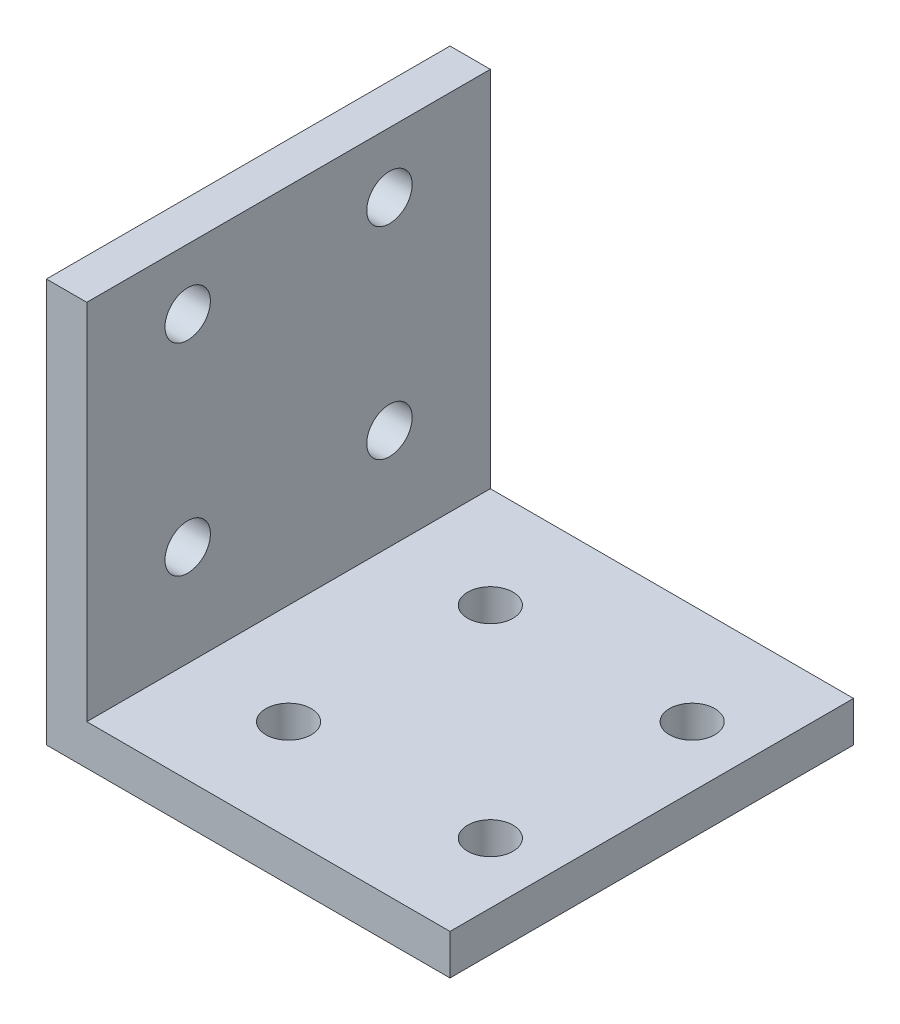
ISO-10303-21;
HEADER;
FILE_DESCRIPTION(('STEP AP214'),'2;1');
FILE_NAME('part.step','',(''),(''),'','','');
FILE_SCHEMA(('AUTOMOTIVE_DESIGN { 1 0 10303 214 1 1 1 1 }'));
ENDSEC;
DATA;
#1=APPLICATION_CONTEXT('core data for automotive mechanical design processes');
#2=APPLICATION_PROTOCOL_DEFINITION('international standard','automotive_design',2000,#1);
#3=PRODUCT_CONTEXT('',#1,'mechanical');
#4=PRODUCT('Part','Part','',(#3));
#5=PRODUCT_RELATED_PRODUCT_CATEGORY('part','',(#4));
#6=PRODUCT_DEFINITION_FORMATION('','',#4);
#7=PRODUCT_DEFINITION_CONTEXT('part definition',#1,'design');
#8=PRODUCT_DEFINITION('design','',#6,#7);
#9=PRODUCT_DEFINITION_SHAPE('','',#8);
#10=(LENGTH_UNIT() NAMED_UNIT(*) SI_UNIT(.MILLI.,.METRE.));
#11=(NAMED_UNIT(*) PLANE_ANGLE_UNIT() SI_UNIT($,.RADIAN.));
#12=(NAMED_UNIT(*) SI_UNIT($,.STERADIAN.) SOLID_ANGLE_UNIT());
#13=UNCERTAINTY_MEASURE_WITH_UNIT(LENGTH_MEASURE(1.E-05),#10,'distance_accuracy_value','');
#14=(GEOMETRIC_REPRESENTATION_CONTEXT(3) GLOBAL_UNCERTAINTY_ASSIGNED_CONTEXT((#13)) GLOBAL_UNIT_ASSIGNED_CONTEXT((#10,
#11,#12)) REPRESENTATION_CONTEXT('',''));
#15=CARTESIAN_POINT('',(0.,0.,0.));
#16=DIRECTION('',(0.,0.,1.));
#17=DIRECTION('',(1.,0.,0.));
#18=AXIS2_PLACEMENT_3D('',#15,#16,#17);
#19=CARTESIAN_POINT('',(40.,0.,40.));
#20=DIRECTION('',(0.,1.,0.));
#21=DIRECTION('',(-1.,0.,0.));
#22=AXIS2_PLACEMENT_3D('',#19,#20,#21);
#23=PLANE('',#22);
#24=CARTESIAN_POINT('',(34.,0.,10.));
#25=DIRECTION('',(0.,1.,0.));
#26=DIRECTION('',(-1.,0.,0.));
#27=AXIS2_PLACEMENT_3D('',#24,#25,#26);
#28=CIRCLE('',#27,2.25);
#29=CARTESIAN_POINT('',(31.75,0.,10.));
#30=VERTEX_POINT('',#29);
#31=EDGE_CURVE('E164',#30,#30,#28,.T.);
#32=ORIENTED_EDGE('',*,*,#31,.T.);
#33=EDGE_LOOP('',(#32));
#34=FACE_BOUND('',#33,.T.);
#35=CARTESIAN_POINT('',(14.,0.,10.));
#36=DIRECTION('',(0.,1.,0.));
#37=DIRECTION('',(-1.,0.,0.));
#38=AXIS2_PLACEMENT_3D('',#35,#36,#37);
#39=CIRCLE('',#38,2.25);
#40=CARTESIAN_POINT('',(11.75,0.,10.));
#41=VERTEX_POINT('',#40);
#42=EDGE_CURVE('E170',#41,#41,#39,.T.);
#43=ORIENTED_EDGE('',*,*,#42,.T.);
#44=EDGE_LOOP('',(#43));
#45=FACE_BOUND('',#44,.T.);
#46=CARTESIAN_POINT('',(34.0000000000001,0.,30.));
#47=DIRECTION('',(0.,1.,0.));
#48=DIRECTION('',(-1.,0.,0.));
#49=AXIS2_PLACEMENT_3D('',#46,#47,#48);
#50=CIRCLE('',#49,2.25);
#51=CARTESIAN_POINT('',(31.7500000000001,0.,30.));
#52=VERTEX_POINT('',#51);
#53=EDGE_CURVE('E176',#52,#52,#50,.T.);
#54=ORIENTED_EDGE('',*,*,#53,.T.);
#55=EDGE_LOOP('',(#54));
#56=FACE_BOUND('',#55,.T.);
#57=CARTESIAN_POINT('',(14.0000000000001,0.,30.));
#58=DIRECTION('',(0.,1.,0.));
#59=DIRECTION('',(-1.,0.,0.));
#60=AXIS2_PLACEMENT_3D('',#57,#58,#59);
#61=CIRCLE('',#60,2.25);
#62=CARTESIAN_POINT('',(11.7500000000001,0.,30.));
#63=VERTEX_POINT('',#62);
#64=EDGE_CURVE('E124',#63,#63,#61,.T.);
#65=ORIENTED_EDGE('',*,*,#64,.T.);
#66=EDGE_LOOP('',(#65));
#67=FACE_BOUND('',#66,.T.);
#68=DIRECTION('',(1.,0.,0.));
#69=VECTOR('',#68,1.);
#70=CARTESIAN_POINT('',(40.,0.,0.));
#71=LINE('',#70,#69);
#72=CARTESIAN_POINT('',(0.,0.,0.));
#73=VERTEX_POINT('',#72);
#74=CARTESIAN_POINT('',(40.,0.,0.));
#75=VERTEX_POINT('',#74);
#76=EDGE_CURVE('E120',#73,#75,#71,.T.);
#77=ORIENTED_EDGE('',*,*,#76,.T.);
#78=DIRECTION('',(0.,0.,-1.));
#79=VECTOR('',#78,1.);
#80=CARTESIAN_POINT('',(40.,0.,40.));
#81=LINE('',#80,#79);
#82=CARTESIAN_POINT('',(40.,0.,40.));
#83=VERTEX_POINT('',#82);
#84=EDGE_CURVE('E11',#83,#75,#81,.T.);
#85=ORIENTED_EDGE('',*,*,#84,.F.);
#86=DIRECTION('',(1.,0.,0.));
#87=VECTOR('',#86,1.);
#88=CARTESIAN_POINT('',(40.,0.,40.));
#89=LINE('',#88,#87);
#90=CARTESIAN_POINT('',(0.,0.,40.));
#91=VERTEX_POINT('',#90);
#92=EDGE_CURVE('E131',#91,#83,#89,.T.);
#93=ORIENTED_EDGE('',*,*,#92,.F.);
#94=DIRECTION('',(0.,0.,-1.));
#95=VECTOR('',#94,1.);
#96=CARTESIAN_POINT('',(0.,0.,40.));
#97=LINE('',#96,#95);
#98=EDGE_CURVE('E116',#91,#73,#97,.T.);
#99=ORIENTED_EDGE('',*,*,#98,.T.);
#100=EDGE_LOOP('',(#77,#85,#93,#99));
#101=FACE_BOUND('',#100,.T.);
#102=ADVANCED_FACE('F34',(#34,#45,#56,#67,#101),#23,.F.);
#103=CARTESIAN_POINT('',(40.,4.,40.));
#104=DIRECTION('',(-1.,0.,0.));
#105=DIRECTION('',(0.,0.,1.));
#106=AXIS2_PLACEMENT_3D('',#103,#104,#105);
#107=PLANE('',#106);
#108=DIRECTION('',(0.,1.,0.));
#109=VECTOR('',#108,1.);
#110=CARTESIAN_POINT('',(40.,4.,0.));
#111=LINE('',#110,#109);
#112=CARTESIAN_POINT('',(40.,4.,0.));
#113=VERTEX_POINT('',#112);
#114=EDGE_CURVE('E123',#75,#113,#111,.T.);
#115=ORIENTED_EDGE('',*,*,#114,.T.);
#116=DIRECTION('',(0.,0.,-1.));
#117=VECTOR('',#116,1.);
#118=CARTESIAN_POINT('',(40.,4.,40.));
#119=LINE('',#118,#117);
#120=CARTESIAN_POINT('',(40.,4.,40.));
#121=VERTEX_POINT('',#120);
#122=EDGE_CURVE('E43',#121,#113,#119,.T.);
#123=ORIENTED_EDGE('',*,*,#122,.F.);
#124=DIRECTION('',(0.,1.,0.));
#125=VECTOR('',#124,1.);
#126=CARTESIAN_POINT('',(40.,4.,40.));
#127=LINE('',#126,#125);
#128=EDGE_CURVE('E89',#83,#121,#127,.T.);
#129=ORIENTED_EDGE('',*,*,#128,.F.);
#130=ORIENTED_EDGE('',*,*,#84,.T.);
#131=EDGE_LOOP('',(#115,#123,#129,#130));
#132=FACE_BOUND('',#131,.T.);
#133=ADVANCED_FACE('F187',(#132),#107,.F.);
#134=CARTESIAN_POINT('',(4.00000000000001,4.,40.));
#135=DIRECTION('',(0.,-1.,0.));
#136=DIRECTION('',(1.,0.,0.));
#137=AXIS2_PLACEMENT_3D('',#134,#135,#136);
#138=PLANE('',#137);
#139=CARTESIAN_POINT('',(34.,4.,10.));
#140=DIRECTION('',(0.,1.,0.));
#141=DIRECTION('',(0.,0.,1.));
#142=AXIS2_PLACEMENT_3D('',#139,#140,#141);
#143=CIRCLE('',#142,2.25);
#144=CARTESIAN_POINT('',(34.,4.,12.25));
#145=VERTEX_POINT('',#144);
#146=EDGE_CURVE('E140',#145,#145,#143,.T.);
#147=ORIENTED_EDGE('',*,*,#146,.F.);
#148=EDGE_LOOP('',(#147));
#149=FACE_BOUND('',#148,.T.);
#150=CARTESIAN_POINT('',(14.,4.,10.));
#151=DIRECTION('',(0.,1.,0.));
#152=DIRECTION('',(0.,0.,1.));
#153=AXIS2_PLACEMENT_3D('',#150,#151,#152);
#154=CIRCLE('',#153,2.25);
#155=CARTESIAN_POINT('',(14.,4.,12.25));
#156=VERTEX_POINT('',#155);
#157=EDGE_CURVE('E167',#156,#156,#154,.T.);
#158=ORIENTED_EDGE('',*,*,#157,.F.);
#159=EDGE_LOOP('',(#158));
#160=FACE_BOUND('',#159,.T.);
#161=CARTESIAN_POINT('',(34.0000000000001,4.,30.));
#162=DIRECTION('',(0.,1.,0.));
#163=DIRECTION('',(0.,0.,1.));
#164=AXIS2_PLACEMENT_3D('',#161,#162,#163);
#165=CIRCLE('',#164,2.25);
#166=CARTESIAN_POINT('',(34.0000000000001,4.,32.25));
#167=VERTEX_POINT('',#166);
#168=EDGE_CURVE('E173',#167,#167,#165,.T.);
#169=ORIENTED_EDGE('',*,*,#168,.F.);
#170=EDGE_LOOP('',(#169));
#171=FACE_BOUND('',#170,.T.);
#172=CARTESIAN_POINT('',(14.0000000000001,4.,30.));
#173=DIRECTION('',(0.,1.,0.));
#174=DIRECTION('',(0.,0.,1.));
#175=AXIS2_PLACEMENT_3D('',#172,#173,#174);
#176=CIRCLE('',#175,2.25);
#177=CARTESIAN_POINT('',(14.0000000000001,4.,32.25));
#178=VERTEX_POINT('',#177);
#179=EDGE_CURVE('E179',#178,#178,#176,.T.);
#180=ORIENTED_EDGE('',*,*,#179,.F.);
#181=EDGE_LOOP('',(#180));
#182=FACE_BOUND('',#181,.T.);
#183=DIRECTION('',(-1.,0.,0.));
#184=VECTOR('',#183,1.);
#185=CARTESIAN_POINT('',(4.00000000000001,4.,0.));
#186=LINE('',#185,#184);
#187=CARTESIAN_POINT('',(4.00000000000001,4.,0.));
#188=VERTEX_POINT('',#187);
#189=EDGE_CURVE('E126',#113,#188,#186,.T.);
#190=ORIENTED_EDGE('',*,*,#189,.T.);
#191=DIRECTION('',(0.,0.,-1.));
#192=VECTOR('',#191,1.);
#193=CARTESIAN_POINT('',(4.00000000000001,4.,40.));
#194=LINE('',#193,#192);
#195=CARTESIAN_POINT('',(4.00000000000001,4.,40.));
#196=VERTEX_POINT('',#195);
#197=EDGE_CURVE('E111',#196,#188,#194,.T.);
#198=ORIENTED_EDGE('',*,*,#197,.F.);
#199=DIRECTION('',(-1.,0.,0.));
#200=VECTOR('',#199,1.);
#201=CARTESIAN_POINT('',(4.00000000000001,4.,40.));
#202=LINE('',#201,#200);
#203=EDGE_CURVE('E102',#121,#196,#202,.T.);
#204=ORIENTED_EDGE('',*,*,#203,.F.);
#205=ORIENTED_EDGE('',*,*,#122,.T.);
#206=EDGE_LOOP('',(#190,#198,#204,#205));
#207=FACE_BOUND('',#206,.T.);
#208=ADVANCED_FACE('F190',(#149,#160,#171,#182,#207),#138,.F.);
#209=CARTESIAN_POINT('',(4.,40.,40.));
#210=DIRECTION('',(-1.,0.,0.));
#211=DIRECTION('',(0.,-1.,0.));
#212=AXIS2_PLACEMENT_3D('',#209,#210,#211);
#213=PLANE('',#212);
#214=CARTESIAN_POINT('',(4.,34.,10.));
#215=DIRECTION('',(1.,0.,0.));
#216=DIRECTION('',(0.,0.,-1.));
#217=AXIS2_PLACEMENT_3D('',#214,#215,#216);
#218=CIRCLE('',#217,2.24999999999999);
#219=CARTESIAN_POINT('',(4.,34.,7.75000000000001));
#220=VERTEX_POINT('',#219);
#221=EDGE_CURVE('E157',#220,#220,#218,.T.);
#222=ORIENTED_EDGE('',*,*,#221,.F.);
#223=EDGE_LOOP('',(#222));
#224=FACE_BOUND('',#223,.T.);
#225=CARTESIAN_POINT('',(4.,33.9999999999999,30.));
#226=DIRECTION('',(1.,0.,0.));
#227=DIRECTION('',(0.,0.,-1.));
#228=AXIS2_PLACEMENT_3D('',#225,#226,#227);
#229=CIRCLE('',#228,2.24999999999999);
#230=CARTESIAN_POINT('',(4.,33.9999999999999,27.75));
#231=VERTEX_POINT('',#230);
#232=EDGE_CURVE('E147',#231,#231,#229,.T.);
#233=ORIENTED_EDGE('',*,*,#232,.F.);
#234=EDGE_LOOP('',(#233));
#235=FACE_BOUND('',#234,.T.);
#236=CARTESIAN_POINT('',(4.00000000000001,14.,9.99999999999979));
#237=DIRECTION('',(1.,0.,0.));
#238=DIRECTION('',(0.,0.,-1.));
#239=AXIS2_PLACEMENT_3D('',#236,#237,#238);
#240=CIRCLE('',#239,2.24999999999999);
#241=CARTESIAN_POINT('',(4.00000000000001,14.,7.7499999999998));
#242=VERTEX_POINT('',#241);
#243=EDGE_CURVE('E144',#242,#242,#240,.T.);
#244=ORIENTED_EDGE('',*,*,#243,.F.);
#245=EDGE_LOOP('',(#244));
#246=FACE_BOUND('',#245,.T.);
#247=CARTESIAN_POINT('',(4.00000000000001,13.9999999999999,29.9999999999998));
#248=DIRECTION('',(1.,0.,0.));
#249=DIRECTION('',(0.,0.,-1.));
#250=AXIS2_PLACEMENT_3D('',#247,#248,#249);
#251=CIRCLE('',#250,2.24999999999999);
#252=CARTESIAN_POINT('',(4.00000000000001,13.9999999999999,27.7499999999998));
#253=VERTEX_POINT('',#252);
#254=EDGE_CURVE('E141',#253,#253,#251,.T.);
#255=ORIENTED_EDGE('',*,*,#254,.F.);
#256=EDGE_LOOP('',(#255));
#257=FACE_BOUND('',#256,.T.);
#258=DIRECTION('',(0.,1.,0.));
#259=VECTOR('',#258,1.);
#260=CARTESIAN_POINT('',(4.,40.,0.));
#261=LINE('',#260,#259);
#262=CARTESIAN_POINT('',(4.,40.,0.));
#263=VERTEX_POINT('',#262);
#264=EDGE_CURVE('E110',#188,#263,#261,.T.);
#265=ORIENTED_EDGE('',*,*,#264,.T.);
#266=DIRECTION('',(0.,0.,-1.));
#267=VECTOR('',#266,1.);
#268=CARTESIAN_POINT('',(4.,40.,40.));
#269=LINE('',#268,#267);
#270=CARTESIAN_POINT('',(4.,40.,40.));
#271=VERTEX_POINT('',#270);
#272=EDGE_CURVE('E107',#271,#263,#269,.T.);
#273=ORIENTED_EDGE('',*,*,#272,.F.);
#274=DIRECTION('',(0.,1.,0.));
#275=VECTOR('',#274,1.);
#276=CARTESIAN_POINT('',(4.,40.,40.));
#277=LINE('',#276,#275);
#278=EDGE_CURVE('E96',#196,#271,#277,.T.);
#279=ORIENTED_EDGE('',*,*,#278,.F.);
#280=ORIENTED_EDGE('',*,*,#197,.T.);
#281=EDGE_LOOP('',(#265,#273,#279,#280));
#282=FACE_BOUND('',#281,.T.);
#283=ADVANCED_FACE('F108',(#224,#235,#246,#257,#282),#213,.F.);
#284=CARTESIAN_POINT('',(0.,40.,40.));
#285=DIRECTION('',(0.,-1.,0.));
#286=DIRECTION('',(0.,0.,-1.));
#287=AXIS2_PLACEMENT_3D('',#284,#285,#286);
#288=PLANE('',#287);
#289=DIRECTION('',(-1.,0.,0.));
#290=VECTOR('',#289,1.);
#291=CARTESIAN_POINT('',(0.,40.,0.));
#292=LINE('',#291,#290);
#293=CARTESIAN_POINT('',(0.,40.,0.));
#294=VERTEX_POINT('',#293);
#295=EDGE_CURVE('E75',#263,#294,#292,.T.);
#296=ORIENTED_EDGE('',*,*,#295,.T.);
#297=DIRECTION('',(0.,0.,-1.));
#298=VECTOR('',#297,1.);
#299=CARTESIAN_POINT('',(0.,40.,40.));
#300=LINE('',#299,#298);
#301=CARTESIAN_POINT('',(0.,40.,40.));
#302=VERTEX_POINT('',#301);
#303=EDGE_CURVE('E112',#302,#294,#300,.T.);
#304=ORIENTED_EDGE('',*,*,#303,.F.);
#305=DIRECTION('',(-1.,0.,0.));
#306=VECTOR('',#305,1.);
#307=CARTESIAN_POINT('',(0.,40.,40.));
#308=LINE('',#307,#306);
#309=EDGE_CURVE('E100',#271,#302,#308,.T.);
#310=ORIENTED_EDGE('',*,*,#309,.F.);
#311=ORIENTED_EDGE('',*,*,#272,.T.);
#312=EDGE_LOOP('',(#296,#304,#310,#311));
#313=FACE_BOUND('',#312,.T.);
#314=ADVANCED_FACE('F114',(#313),#288,.F.);
#315=CARTESIAN_POINT('',(0.,0.,40.));
#316=DIRECTION('',(1.,0.,0.));
#317=DIRECTION('',(0.,0.,-1.));
#318=AXIS2_PLACEMENT_3D('',#315,#316,#317);
#319=PLANE('',#318);
#320=CARTESIAN_POINT('',(0.,34.,10.));
#321=DIRECTION('',(1.,0.,0.));
#322=DIRECTION('',(0.,0.,-1.));
#323=AXIS2_PLACEMENT_3D('',#320,#321,#322);
#324=CIRCLE('',#323,2.24999999999999);
#325=CARTESIAN_POINT('',(0.,34.,7.75000000000001));
#326=VERTEX_POINT('',#325);
#327=EDGE_CURVE('E37',#326,#326,#324,.T.);
#328=ORIENTED_EDGE('',*,*,#327,.T.);
#329=EDGE_LOOP('',(#328));
#330=FACE_BOUND('',#329,.T.);
#331=CARTESIAN_POINT('',(0.,33.9999999999999,30.));
#332=DIRECTION('',(1.,0.,0.));
#333=DIRECTION('',(0.,0.,-1.));
#334=AXIS2_PLACEMENT_3D('',#331,#332,#333);
#335=CIRCLE('',#334,2.24999999999999);
#336=CARTESIAN_POINT('',(0.,33.9999999999999,27.75));
#337=VERTEX_POINT('',#336);
#338=EDGE_CURVE('E145',#337,#337,#335,.T.);
#339=ORIENTED_EDGE('',*,*,#338,.T.);
#340=EDGE_LOOP('',(#339));
#341=FACE_BOUND('',#340,.T.);
#342=CARTESIAN_POINT('',(0.,14.,9.99999999999979));
#343=DIRECTION('',(1.,0.,0.));
#344=DIRECTION('',(0.,0.,-1.));
#345=AXIS2_PLACEMENT_3D('',#342,#343,#344);
#346=CIRCLE('',#345,2.24999999999999);
#347=CARTESIAN_POINT('',(0.,14.,7.7499999999998));
#348=VERTEX_POINT('',#347);
#349=EDGE_CURVE('E142',#348,#348,#346,.T.);
#350=ORIENTED_EDGE('',*,*,#349,.T.);
#351=EDGE_LOOP('',(#350));
#352=FACE_BOUND('',#351,.T.);
#353=CARTESIAN_POINT('',(0.,13.9999999999999,29.9999999999998));
#354=DIRECTION('',(1.,0.,0.));
#355=DIRECTION('',(0.,0.,-1.));
#356=AXIS2_PLACEMENT_3D('',#353,#354,#355);
#357=CIRCLE('',#356,2.24999999999999);
#358=CARTESIAN_POINT('',(0.,13.9999999999999,27.7499999999998));
#359=VERTEX_POINT('',#358);
#360=EDGE_CURVE('E137',#359,#359,#357,.T.);
#361=ORIENTED_EDGE('',*,*,#360,.T.);
#362=EDGE_LOOP('',(#361));
#363=FACE_BOUND('',#362,.T.);
#364=DIRECTION('',(0.,-1.,0.));
#365=VECTOR('',#364,1.);
#366=CARTESIAN_POINT('',(0.,0.,0.));
#367=LINE('',#366,#365);
#368=EDGE_CURVE('E81',#294,#73,#367,.T.);
#369=ORIENTED_EDGE('',*,*,#368,.T.);
#370=ORIENTED_EDGE('',*,*,#98,.F.);
#371=DIRECTION('',(0.,-1.,0.));
#372=VECTOR('',#371,1.);
#373=CARTESIAN_POINT('',(0.,0.,40.));
#374=LINE('',#373,#372);
#375=EDGE_CURVE('E52',#302,#91,#374,.T.);
#376=ORIENTED_EDGE('',*,*,#375,.F.);
#377=ORIENTED_EDGE('',*,*,#303,.T.);
#378=EDGE_LOOP('',(#369,#370,#376,#377));
#379=FACE_BOUND('',#378,.T.);
#380=ADVANCED_FACE('F195',(#330,#341,#352,#363,#379),#319,.F.);
#381=CARTESIAN_POINT('',(0.,0.,40.));
#382=DIRECTION('',(0.,0.,-1.));
#383=DIRECTION('',(-1.,0.,0.));
#384=AXIS2_PLACEMENT_3D('',#381,#382,#383);
#385=PLANE('',#384);
#386=ORIENTED_EDGE('',*,*,#92,.T.);
#387=ORIENTED_EDGE('',*,*,#128,.T.);
#388=ORIENTED_EDGE('',*,*,#203,.T.);
#389=ORIENTED_EDGE('',*,*,#278,.T.);
#390=ORIENTED_EDGE('',*,*,#309,.T.);
#391=ORIENTED_EDGE('',*,*,#375,.T.);
#392=EDGE_LOOP('',(#386,#387,#388,#389,#390,#391));
#393=FACE_BOUND('',#392,.T.);
#394=ADVANCED_FACE('F98',(#393),#385,.F.);
#395=CARTESIAN_POINT('',(0.,0.,0.));
#396=DIRECTION('',(0.,0.,-1.));
#397=DIRECTION('',(-1.,0.,0.));
#398=AXIS2_PLACEMENT_3D('',#395,#396,#397);
#399=PLANE('',#398);
#400=ORIENTED_EDGE('',*,*,#76,.F.);
#401=ORIENTED_EDGE('',*,*,#368,.F.);
#402=ORIENTED_EDGE('',*,*,#295,.F.);
#403=ORIENTED_EDGE('',*,*,#264,.F.);
#404=ORIENTED_EDGE('',*,*,#189,.F.);
#405=ORIENTED_EDGE('',*,*,#114,.F.);
#406=EDGE_LOOP('',(#400,#401,#402,#403,#404,#405));
#407=FACE_BOUND('',#406,.T.);
#408=ADVANCED_FACE('F193',(#407),#399,.T.);
#409=CARTESIAN_POINT('',(14.0000000000001,4.,30.));
#410=DIRECTION('',(0.,1.,0.));
#411=DIRECTION('',(0.,0.,1.));
#412=AXIS2_PLACEMENT_3D('',#409,#410,#411);
#413=CYLINDRICAL_SURFACE('',#412,2.25);
#414=ORIENTED_EDGE('',*,*,#179,.T.);
#415=EDGE_LOOP('',(#414));
#416=FACE_BOUND('',#415,.T.);
#417=ORIENTED_EDGE('',*,*,#64,.F.);
#418=EDGE_LOOP('',(#417));
#419=FACE_BOUND('',#418,.T.);
#420=ADVANCED_FACE('F219',(#416,#419),#413,.F.);
#421=CARTESIAN_POINT('',(34.0000000000001,4.,30.));
#422=DIRECTION('',(0.,1.,0.));
#423=DIRECTION('',(0.,0.,1.));
#424=AXIS2_PLACEMENT_3D('',#421,#422,#423);
#425=CYLINDRICAL_SURFACE('',#424,2.25);
#426=ORIENTED_EDGE('',*,*,#168,.T.);
#427=EDGE_LOOP('',(#426));
#428=FACE_BOUND('',#427,.T.);
#429=ORIENTED_EDGE('',*,*,#53,.F.);
#430=EDGE_LOOP('',(#429));
#431=FACE_BOUND('',#430,.T.);
#432=ADVANCED_FACE('F221',(#428,#431),#425,.F.);
#433=CARTESIAN_POINT('',(14.,4.,10.));
#434=DIRECTION('',(0.,1.,0.));
#435=DIRECTION('',(0.,0.,1.));
#436=AXIS2_PLACEMENT_3D('',#433,#434,#435);
#437=CYLINDRICAL_SURFACE('',#436,2.25);
#438=ORIENTED_EDGE('',*,*,#157,.T.);
#439=EDGE_LOOP('',(#438));
#440=FACE_BOUND('',#439,.T.);
#441=ORIENTED_EDGE('',*,*,#42,.F.);
#442=EDGE_LOOP('',(#441));
#443=FACE_BOUND('',#442,.T.);
#444=ADVANCED_FACE('F228',(#440,#443),#437,.F.);
#445=CARTESIAN_POINT('',(34.,4.,10.));
#446=DIRECTION('',(0.,1.,0.));
#447=DIRECTION('',(0.,0.,1.));
#448=AXIS2_PLACEMENT_3D('',#445,#446,#447);
#449=CYLINDRICAL_SURFACE('',#448,2.25);
#450=ORIENTED_EDGE('',*,*,#146,.T.);
#451=EDGE_LOOP('',(#450));
#452=FACE_BOUND('',#451,.T.);
#453=ORIENTED_EDGE('',*,*,#31,.F.);
#454=EDGE_LOOP('',(#453));
#455=FACE_BOUND('',#454,.T.);
#456=ADVANCED_FACE('F234',(#452,#455),#449,.F.);
#457=CARTESIAN_POINT('',(4.,13.9999999999999,29.9999999999998));
#458=DIRECTION('',(1.,0.,0.));
#459=DIRECTION('',(0.,0.,-1.));
#460=AXIS2_PLACEMENT_3D('',#457,#458,#459);
#461=CYLINDRICAL_SURFACE('',#460,2.24999999999999);
#462=ORIENTED_EDGE('',*,*,#254,.T.);
#463=EDGE_LOOP('',(#462));
#464=FACE_BOUND('',#463,.T.);
#465=ORIENTED_EDGE('',*,*,#360,.F.);
#466=EDGE_LOOP('',(#465));
#467=FACE_BOUND('',#466,.T.);
#468=ADVANCED_FACE('F238',(#464,#467),#461,.F.);
#469=CARTESIAN_POINT('',(4.,14.,9.99999999999979));
#470=DIRECTION('',(1.,0.,0.));
#471=DIRECTION('',(0.,0.,-1.));
#472=AXIS2_PLACEMENT_3D('',#469,#470,#471);
#473=CYLINDRICAL_SURFACE('',#472,2.24999999999999);
#474=ORIENTED_EDGE('',*,*,#243,.T.);
#475=EDGE_LOOP('',(#474));
#476=FACE_BOUND('',#475,.T.);
#477=ORIENTED_EDGE('',*,*,#349,.F.);
#478=EDGE_LOOP('',(#477));
#479=FACE_BOUND('',#478,.T.);
#480=ADVANCED_FACE('F242',(#476,#479),#473,.F.);
#481=CARTESIAN_POINT('',(4.,33.9999999999999,30.));
#482=DIRECTION('',(1.,0.,0.));
#483=DIRECTION('',(0.,0.,-1.));
#484=AXIS2_PLACEMENT_3D('',#481,#482,#483);
#485=CYLINDRICAL_SURFACE('',#484,2.24999999999999);
#486=ORIENTED_EDGE('',*,*,#232,.T.);
#487=EDGE_LOOP('',(#486));
#488=FACE_BOUND('',#487,.T.);
#489=ORIENTED_EDGE('',*,*,#338,.F.);
#490=EDGE_LOOP('',(#489));
#491=FACE_BOUND('',#490,.T.);
#492=ADVANCED_FACE('F246',(#488,#491),#485,.F.);
#493=CARTESIAN_POINT('',(4.,34.,10.));
#494=DIRECTION('',(1.,0.,0.));
#495=DIRECTION('',(0.,0.,-1.));
#496=AXIS2_PLACEMENT_3D('',#493,#494,#495);
#497=CYLINDRICAL_SURFACE('',#496,2.24999999999999);
#498=ORIENTED_EDGE('',*,*,#221,.T.);
#499=EDGE_LOOP('',(#498));
#500=FACE_BOUND('',#499,.T.);
#501=ORIENTED_EDGE('',*,*,#327,.F.);
#502=EDGE_LOOP('',(#501));
#503=FACE_BOUND('',#502,.T.);
#504=ADVANCED_FACE('F250',(#500,#503),#497,.F.);
#505=CLOSED_SHELL('',(#102,#133,#208,#283,#314,#380,#394,#408,#420,#432,#444,#456,#468,#480,
#492,#504));
#506=MANIFOLD_SOLID_BREP('B2',#505);
#507=ADVANCED_BREP_SHAPE_REPRESENTATION('',(#18,#506),#14);
#508=SHAPE_DEFINITION_REPRESENTATION(#9,#507);
ENDSEC;
END-ISO-10303-21;
